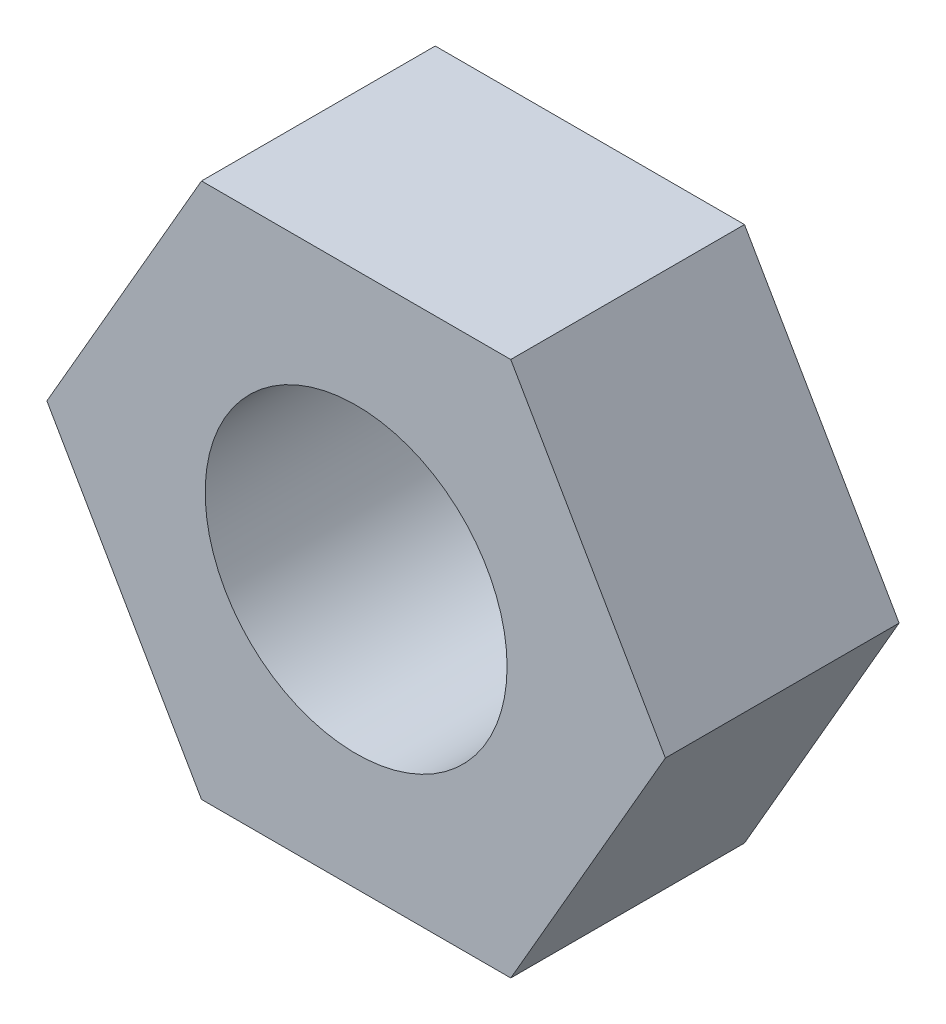
ISO-10303-21;
HEADER;
FILE_DESCRIPTION(('STEP AP214'),'2;1');
FILE_NAME('part.step','',(''),(''),'','','');
FILE_SCHEMA(('AUTOMOTIVE_DESIGN { 1 0 10303 214 1 1 1 1 }'));
ENDSEC;
DATA;
#1=APPLICATION_CONTEXT('core data for automotive mechanical design processes');
#2=APPLICATION_PROTOCOL_DEFINITION('international standard','automotive_design',2000,#1);
#3=PRODUCT_CONTEXT('',#1,'mechanical');
#4=PRODUCT('Part','Part','',(#3));
#5=PRODUCT_RELATED_PRODUCT_CATEGORY('part','',(#4));
#6=PRODUCT_DEFINITION_FORMATION('','',#4);
#7=PRODUCT_DEFINITION_CONTEXT('part definition',#1,'design');
#8=PRODUCT_DEFINITION('design','',#6,#7);
#9=PRODUCT_DEFINITION_SHAPE('','',#8);
#10=(LENGTH_UNIT() NAMED_UNIT(*) SI_UNIT(.MILLI.,.METRE.));
#11=(NAMED_UNIT(*) PLANE_ANGLE_UNIT() SI_UNIT($,.RADIAN.));
#12=(NAMED_UNIT(*) SI_UNIT($,.STERADIAN.) SOLID_ANGLE_UNIT());
#13=UNCERTAINTY_MEASURE_WITH_UNIT(LENGTH_MEASURE(1.E-05),#10,'distance_accuracy_value','');
#14=(GEOMETRIC_REPRESENTATION_CONTEXT(3) GLOBAL_UNCERTAINTY_ASSIGNED_CONTEXT((#13)) GLOBAL_UNIT_ASSIGNED_CONTEXT((#10,
#11,#12)) REPRESENTATION_CONTEXT('',''));
#15=CARTESIAN_POINT('',(0.,0.,0.));
#16=DIRECTION('',(0.,0.,1.));
#17=DIRECTION('',(1.,0.,0.));
#18=AXIS2_PLACEMENT_3D('',#15,#16,#17);
#19=CARTESIAN_POINT('',(0.,0.,2.4));
#20=DIRECTION('',(0.,0.,1.));
#21=DIRECTION('',(1.,0.,0.));
#22=AXIS2_PLACEMENT_3D('',#19,#20,#21);
#23=PLANE('',#22);
#24=DIRECTION('',(0.5,0.866025403784439,0.));
#25=VECTOR('',#24,1.);
#26=CARTESIAN_POINT('',(1.58771324027147,-2.75,2.4));
#27=LINE('',#26,#25);
#28=CARTESIAN_POINT('',(1.58771324027147,-2.75,2.4));
#29=VERTEX_POINT('',#28);
#30=CARTESIAN_POINT('',(3.17542648054294,0.,2.4));
#31=VERTEX_POINT('',#30);
#32=EDGE_CURVE('E139',#29,#31,#27,.T.);
#33=ORIENTED_EDGE('',*,*,#32,.T.);
#34=DIRECTION('',(-0.5,0.866025403784438,0.));
#35=VECTOR('',#34,1.);
#36=CARTESIAN_POINT('',(3.17542648054294,0.,2.4));
#37=LINE('',#36,#35);
#38=CARTESIAN_POINT('',(1.58771324027147,2.75,2.4));
#39=VERTEX_POINT('',#38);
#40=EDGE_CURVE('E97',#31,#39,#37,.T.);
#41=ORIENTED_EDGE('',*,*,#40,.T.);
#42=DIRECTION('',(-1.,0.,0.));
#43=VECTOR('',#42,1.);
#44=CARTESIAN_POINT('',(1.58771324027147,2.75,2.4));
#45=LINE('',#44,#43);
#46=CARTESIAN_POINT('',(-1.58771324027147,2.75,2.4));
#47=VERTEX_POINT('',#46);
#48=EDGE_CURVE('E110',#39,#47,#45,.T.);
#49=ORIENTED_EDGE('',*,*,#48,.T.);
#50=DIRECTION('',(-0.5,-0.866025403784438,0.));
#51=VECTOR('',#50,1.);
#52=CARTESIAN_POINT('',(-1.58771324027147,2.75,2.4));
#53=LINE('',#52,#51);
#54=CARTESIAN_POINT('',(-3.17542648054294,0.,2.4));
#55=VERTEX_POINT('',#54);
#56=EDGE_CURVE('E104',#47,#55,#53,.T.);
#57=ORIENTED_EDGE('',*,*,#56,.T.);
#58=DIRECTION('',(0.5,-0.866025403784438,0.));
#59=VECTOR('',#58,1.);
#60=CARTESIAN_POINT('',(-3.17542648054294,0.,2.4));
#61=LINE('',#60,#59);
#62=CARTESIAN_POINT('',(-1.58771324027147,-2.75,2.4));
#63=VERTEX_POINT('',#62);
#64=EDGE_CURVE('E108',#55,#63,#61,.T.);
#65=ORIENTED_EDGE('',*,*,#64,.T.);
#66=DIRECTION('',(1.,0.,0.));
#67=VECTOR('',#66,1.);
#68=CARTESIAN_POINT('',(-1.58771324027147,-2.75,2.4));
#69=LINE('',#68,#67);
#70=EDGE_CURVE('E60',#63,#29,#69,.T.);
#71=ORIENTED_EDGE('',*,*,#70,.T.);
#72=EDGE_LOOP('',(#33,#41,#49,#57,#65,#71));
#73=FACE_BOUND('',#72,.T.);
#74=CARTESIAN_POINT('',(0.,0.,2.4));
#75=DIRECTION('',(0.,0.,1.));
#76=DIRECTION('',(1.,0.,0.));
#77=AXIS2_PLACEMENT_3D('',#74,#75,#76);
#78=CIRCLE('',#77,1.55);
#79=CARTESIAN_POINT('',(1.55,0.,2.4));
#80=VERTEX_POINT('',#79);
#81=EDGE_CURVE('E132',#80,#80,#78,.T.);
#82=ORIENTED_EDGE('',*,*,#81,.F.);
#83=EDGE_LOOP('',(#82));
#84=FACE_BOUND('',#83,.T.);
#85=ADVANCED_FACE('F43',(#73,#84),#23,.T.);
#86=CARTESIAN_POINT('',(0.,0.,0.));
#87=DIRECTION('',(0.,0.,1.));
#88=DIRECTION('',(1.,0.,0.));
#89=AXIS2_PLACEMENT_3D('',#86,#87,#88);
#90=PLANE('',#89);
#91=DIRECTION('',(0.5,0.866025403784439,0.));
#92=VECTOR('',#91,1.);
#93=CARTESIAN_POINT('',(1.58771324027147,-2.75,0.));
#94=LINE('',#93,#92);
#95=CARTESIAN_POINT('',(1.58771324027147,-2.75,0.));
#96=VERTEX_POINT('',#95);
#97=CARTESIAN_POINT('',(3.17542648054294,0.,0.));
#98=VERTEX_POINT('',#97);
#99=EDGE_CURVE('E128',#96,#98,#94,.T.);
#100=ORIENTED_EDGE('',*,*,#99,.F.);
#101=DIRECTION('',(1.,0.,0.));
#102=VECTOR('',#101,1.);
#103=CARTESIAN_POINT('',(-1.58771324027147,-2.75,0.));
#104=LINE('',#103,#102);
#105=CARTESIAN_POINT('',(-1.58771324027147,-2.75,0.));
#106=VERTEX_POINT('',#105);
#107=EDGE_CURVE('E89',#106,#96,#104,.T.);
#108=ORIENTED_EDGE('',*,*,#107,.F.);
#109=DIRECTION('',(0.5,-0.866025403784438,0.));
#110=VECTOR('',#109,1.);
#111=CARTESIAN_POINT('',(-3.17542648054294,0.,0.));
#112=LINE('',#111,#110);
#113=CARTESIAN_POINT('',(-3.17542648054294,0.,0.));
#114=VERTEX_POINT('',#113);
#115=EDGE_CURVE('E83',#114,#106,#112,.T.);
#116=ORIENTED_EDGE('',*,*,#115,.F.);
#117=DIRECTION('',(-0.5,-0.866025403784438,0.));
#118=VECTOR('',#117,1.);
#119=CARTESIAN_POINT('',(-1.58771324027147,2.75,0.));
#120=LINE('',#119,#118);
#121=CARTESIAN_POINT('',(-1.58771324027147,2.75,0.));
#122=VERTEX_POINT('',#121);
#123=EDGE_CURVE('E118',#122,#114,#120,.T.);
#124=ORIENTED_EDGE('',*,*,#123,.F.);
#125=DIRECTION('',(-1.,0.,0.));
#126=VECTOR('',#125,1.);
#127=CARTESIAN_POINT('',(1.58771324027147,2.75,0.));
#128=LINE('',#127,#126);
#129=CARTESIAN_POINT('',(1.58771324027147,2.75,0.));
#130=VERTEX_POINT('',#129);
#131=EDGE_CURVE('E134',#130,#122,#128,.T.);
#132=ORIENTED_EDGE('',*,*,#131,.F.);
#133=DIRECTION('',(-0.5,0.866025403784438,0.));
#134=VECTOR('',#133,1.);
#135=CARTESIAN_POINT('',(3.17542648054294,0.,0.));
#136=LINE('',#135,#134);
#137=EDGE_CURVE('E131',#98,#130,#136,.T.);
#138=ORIENTED_EDGE('',*,*,#137,.F.);
#139=EDGE_LOOP('',(#100,#108,#116,#124,#132,#138));
#140=FACE_BOUND('',#139,.T.);
#141=CARTESIAN_POINT('',(0.,0.,0.));
#142=DIRECTION('',(0.,0.,1.));
#143=DIRECTION('',(1.,0.,0.));
#144=AXIS2_PLACEMENT_3D('',#141,#142,#143);
#145=CIRCLE('',#144,1.55);
#146=CARTESIAN_POINT('',(1.55,0.,0.));
#147=VERTEX_POINT('',#146);
#148=EDGE_CURVE('E232',#147,#147,#145,.T.);
#149=ORIENTED_EDGE('',*,*,#148,.T.);
#150=EDGE_LOOP('',(#149));
#151=FACE_BOUND('',#150,.T.);
#152=ADVANCED_FACE('F148',(#140,#151),#90,.F.);
#153=CARTESIAN_POINT('',(1.58771324027147,-2.75,2.4));
#154=DIRECTION('',(-0.866025403784439,0.5,0.));
#155=DIRECTION('',(-0.5,-0.866025403784439,0.));
#156=AXIS2_PLACEMENT_3D('',#153,#154,#155);
#157=PLANE('',#156);
#158=ORIENTED_EDGE('',*,*,#99,.T.);
#159=DIRECTION('',(0.,0.,-1.));
#160=VECTOR('',#159,1.);
#161=CARTESIAN_POINT('',(3.17542648054294,0.,2.4));
#162=LINE('',#161,#160);
#163=EDGE_CURVE('E11',#31,#98,#162,.T.);
#164=ORIENTED_EDGE('',*,*,#163,.F.);
#165=ORIENTED_EDGE('',*,*,#32,.F.);
#166=DIRECTION('',(0.,0.,-1.));
#167=VECTOR('',#166,1.);
#168=CARTESIAN_POINT('',(1.58771324027147,-2.75,2.4));
#169=LINE('',#168,#167);
#170=EDGE_CURVE('E124',#29,#96,#169,.T.);
#171=ORIENTED_EDGE('',*,*,#170,.T.);
#172=EDGE_LOOP('',(#158,#164,#165,#171));
#173=FACE_BOUND('',#172,.T.);
#174=ADVANCED_FACE('F45',(#173),#157,.F.);
#175=CARTESIAN_POINT('',(3.17542648054294,0.,2.4));
#176=DIRECTION('',(-0.866025403784438,-0.5,0.));
#177=DIRECTION('',(0.5,-0.866025403784439,0.));
#178=AXIS2_PLACEMENT_3D('',#175,#176,#177);
#179=PLANE('',#178);
#180=ORIENTED_EDGE('',*,*,#137,.T.);
#181=DIRECTION('',(0.,0.,-1.));
#182=VECTOR('',#181,1.);
#183=CARTESIAN_POINT('',(1.58771324027147,2.75,2.4));
#184=LINE('',#183,#182);
#185=EDGE_CURVE('E52',#39,#130,#184,.T.);
#186=ORIENTED_EDGE('',*,*,#185,.F.);
#187=ORIENTED_EDGE('',*,*,#40,.F.);
#188=ORIENTED_EDGE('',*,*,#163,.T.);
#189=EDGE_LOOP('',(#180,#186,#187,#188));
#190=FACE_BOUND('',#189,.T.);
#191=ADVANCED_FACE('F173',(#190),#179,.F.);
#192=CARTESIAN_POINT('',(1.58771324027147,2.75,2.4));
#193=DIRECTION('',(0.,-1.,0.));
#194=DIRECTION('',(0.,0.,-1.));
#195=AXIS2_PLACEMENT_3D('',#192,#193,#194);
#196=PLANE('',#195);
#197=ORIENTED_EDGE('',*,*,#131,.T.);
#198=DIRECTION('',(0.,0.,-1.));
#199=VECTOR('',#198,1.);
#200=CARTESIAN_POINT('',(-1.58771324027147,2.75,2.4));
#201=LINE('',#200,#199);
#202=EDGE_CURVE('E119',#47,#122,#201,.T.);
#203=ORIENTED_EDGE('',*,*,#202,.F.);
#204=ORIENTED_EDGE('',*,*,#48,.F.);
#205=ORIENTED_EDGE('',*,*,#185,.T.);
#206=EDGE_LOOP('',(#197,#203,#204,#205));
#207=FACE_BOUND('',#206,.T.);
#208=ADVANCED_FACE('F145',(#207),#196,.F.);
#209=CARTESIAN_POINT('',(-1.58771324027147,2.75,2.4));
#210=DIRECTION('',(0.866025403784439,-0.5,0.));
#211=DIRECTION('',(0.5,0.866025403784439,0.));
#212=AXIS2_PLACEMENT_3D('',#209,#210,#211);
#213=PLANE('',#212);
#214=ORIENTED_EDGE('',*,*,#123,.T.);
#215=DIRECTION('',(0.,0.,-1.));
#216=VECTOR('',#215,1.);
#217=CARTESIAN_POINT('',(-3.17542648054294,0.,2.4));
#218=LINE('',#217,#216);
#219=EDGE_CURVE('E115',#55,#114,#218,.T.);
#220=ORIENTED_EDGE('',*,*,#219,.F.);
#221=ORIENTED_EDGE('',*,*,#56,.F.);
#222=ORIENTED_EDGE('',*,*,#202,.T.);
#223=EDGE_LOOP('',(#214,#220,#221,#222));
#224=FACE_BOUND('',#223,.T.);
#225=ADVANCED_FACE('F116',(#224),#213,.F.);
#226=CARTESIAN_POINT('',(-3.17542648054294,0.,2.4));
#227=DIRECTION('',(0.866025403784439,0.5,0.));
#228=DIRECTION('',(-0.5,0.866025403784439,0.));
#229=AXIS2_PLACEMENT_3D('',#226,#227,#228);
#230=PLANE('',#229);
#231=ORIENTED_EDGE('',*,*,#115,.T.);
#232=DIRECTION('',(0.,0.,-1.));
#233=VECTOR('',#232,1.);
#234=CARTESIAN_POINT('',(-1.58771324027147,-2.75,2.4));
#235=LINE('',#234,#233);
#236=EDGE_CURVE('E120',#63,#106,#235,.T.);
#237=ORIENTED_EDGE('',*,*,#236,.F.);
#238=ORIENTED_EDGE('',*,*,#64,.F.);
#239=ORIENTED_EDGE('',*,*,#219,.T.);
#240=EDGE_LOOP('',(#231,#237,#238,#239));
#241=FACE_BOUND('',#240,.T.);
#242=ADVANCED_FACE('F122',(#241),#230,.F.);
#243=CARTESIAN_POINT('',(-1.58771324027147,-2.75,2.4));
#244=DIRECTION('',(0.,1.,0.));
#245=DIRECTION('',(0.,0.,1.));
#246=AXIS2_PLACEMENT_3D('',#243,#244,#245);
#247=PLANE('',#246);
#248=ORIENTED_EDGE('',*,*,#107,.T.);
#249=ORIENTED_EDGE('',*,*,#170,.F.);
#250=ORIENTED_EDGE('',*,*,#70,.F.);
#251=ORIENTED_EDGE('',*,*,#236,.T.);
#252=EDGE_LOOP('',(#248,#249,#250,#251));
#253=FACE_BOUND('',#252,.T.);
#254=ADVANCED_FACE('F153',(#253),#247,.F.);
#255=CARTESIAN_POINT('',(0.,0.,2.4));
#256=DIRECTION('',(0.,0.,-1.));
#257=DIRECTION('',(-1.,0.,0.));
#258=AXIS2_PLACEMENT_3D('',#255,#256,#257);
#259=CYLINDRICAL_SURFACE('',#258,1.55);
#260=ORIENTED_EDGE('',*,*,#81,.T.);
#261=EDGE_LOOP('',(#260));
#262=FACE_BOUND('',#261,.T.);
#263=ORIENTED_EDGE('',*,*,#148,.F.);
#264=EDGE_LOOP('',(#263));
#265=FACE_BOUND('',#264,.T.);
#266=ADVANCED_FACE('F155',(#262,#265),#259,.F.);
#267=CLOSED_SHELL('',(#85,#152,#174,#191,#208,#225,#242,#254,#266));
#268=MANIFOLD_SOLID_BREP('B2',#267);
#269=ADVANCED_BREP_SHAPE_REPRESENTATION('',(#18,#268),#14);
#270=SHAPE_DEFINITION_REPRESENTATION(#9,#269);
ENDSEC;
END-ISO-10303-21;
